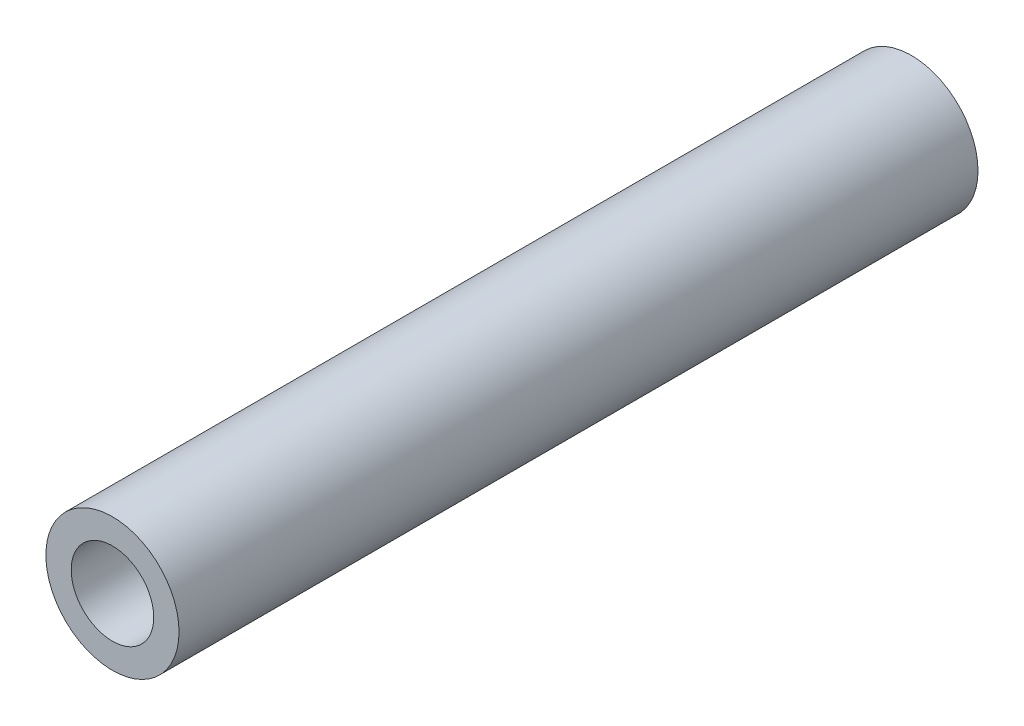
ISO-10303-21;
HEADER;
FILE_DESCRIPTION(('STEP AP214'),'2;1');
FILE_NAME('part.step','',(''),(''),'','','');
FILE_SCHEMA(('AUTOMOTIVE_DESIGN { 1 0 10303 214 1 1 1 1 }'));
ENDSEC;
DATA;
#1=APPLICATION_CONTEXT('core data for automotive mechanical design processes');
#2=APPLICATION_PROTOCOL_DEFINITION('international standard','automotive_design',2000,#1);
#3=PRODUCT_CONTEXT('',#1,'mechanical');
#4=PRODUCT('Part','Part','',(#3));
#5=PRODUCT_RELATED_PRODUCT_CATEGORY('part','',(#4));
#6=PRODUCT_DEFINITION_FORMATION('','',#4);
#7=PRODUCT_DEFINITION_CONTEXT('part definition',#1,'design');
#8=PRODUCT_DEFINITION('design','',#6,#7);
#9=PRODUCT_DEFINITION_SHAPE('','',#8);
#10=(LENGTH_UNIT() NAMED_UNIT(*) SI_UNIT(.MILLI.,.METRE.));
#11=(NAMED_UNIT(*) PLANE_ANGLE_UNIT() SI_UNIT($,.RADIAN.));
#12=(NAMED_UNIT(*) SI_UNIT($,.STERADIAN.) SOLID_ANGLE_UNIT());
#13=UNCERTAINTY_MEASURE_WITH_UNIT(LENGTH_MEASURE(1.E-05),#10,'distance_accuracy_value','');
#14=(GEOMETRIC_REPRESENTATION_CONTEXT(3) GLOBAL_UNCERTAINTY_ASSIGNED_CONTEXT((#13)) GLOBAL_UNIT_ASSIGNED_CONTEXT((#10,
#11,#12)) REPRESENTATION_CONTEXT('',''));
#15=CARTESIAN_POINT('',(0.,0.,0.));
#16=DIRECTION('',(0.,0.,1.));
#17=DIRECTION('',(1.,0.,0.));
#18=AXIS2_PLACEMENT_3D('',#15,#16,#17);
#19=CARTESIAN_POINT('',(0.,0.,30.));
#20=DIRECTION('',(0.,0.,1.));
#21=DIRECTION('',(1.,0.,0.));
#22=AXIS2_PLACEMENT_3D('',#19,#20,#21);
#23=PLANE('',#22);
#24=CARTESIAN_POINT('',(0.,0.,30.));
#25=DIRECTION('',(0.,0.,1.));
#26=DIRECTION('',(1.,0.,0.));
#27=AXIS2_PLACEMENT_3D('',#24,#25,#26);
#28=CIRCLE('',#27,2.5);
#29=CARTESIAN_POINT('',(2.5,0.,30.));
#30=VERTEX_POINT('',#29);
#31=EDGE_CURVE('E10',#30,#30,#28,.T.);
#32=ORIENTED_EDGE('',*,*,#31,.T.);
#33=EDGE_LOOP('',(#32));
#34=FACE_BOUND('',#33,.T.);
#35=CARTESIAN_POINT('',(0.,0.,30.));
#36=DIRECTION('',(0.,0.,1.));
#37=DIRECTION('',(1.,0.,0.));
#38=AXIS2_PLACEMENT_3D('',#35,#36,#37);
#39=CIRCLE('',#38,1.55);
#40=CARTESIAN_POINT('',(1.55,0.,30.));
#41=VERTEX_POINT('',#40);
#42=EDGE_CURVE('E44',#41,#41,#39,.T.);
#43=ORIENTED_EDGE('',*,*,#42,.F.);
#44=EDGE_LOOP('',(#43));
#45=FACE_BOUND('',#44,.T.);
#46=ADVANCED_FACE('F33',(#34,#45),#23,.T.);
#47=CARTESIAN_POINT('',(0.,0.,0.));
#48=DIRECTION('',(0.,0.,1.));
#49=DIRECTION('',(1.,0.,0.));
#50=AXIS2_PLACEMENT_3D('',#47,#48,#49);
#51=PLANE('',#50);
#52=CARTESIAN_POINT('',(0.,0.,0.));
#53=DIRECTION('',(0.,0.,1.));
#54=DIRECTION('',(1.,0.,0.));
#55=AXIS2_PLACEMENT_3D('',#52,#53,#54);
#56=CIRCLE('',#55,2.5);
#57=CARTESIAN_POINT('',(2.5,0.,0.));
#58=VERTEX_POINT('',#57);
#59=EDGE_CURVE('E37',#58,#58,#56,.T.);
#60=ORIENTED_EDGE('',*,*,#59,.F.);
#61=EDGE_LOOP('',(#60));
#62=FACE_BOUND('',#61,.T.);
#63=CARTESIAN_POINT('',(0.,0.,0.));
#64=DIRECTION('',(0.,0.,1.));
#65=DIRECTION('',(1.,0.,0.));
#66=AXIS2_PLACEMENT_3D('',#63,#64,#65);
#67=CIRCLE('',#66,1.55);
#68=CARTESIAN_POINT('',(1.55,0.,0.));
#69=VERTEX_POINT('',#68);
#70=EDGE_CURVE('E46',#69,#69,#67,.T.);
#71=ORIENTED_EDGE('',*,*,#70,.T.);
#72=EDGE_LOOP('',(#71));
#73=FACE_BOUND('',#72,.T.);
#74=ADVANCED_FACE('F56',(#62,#73),#51,.F.);
#75=CARTESIAN_POINT('',(0.,0.,30.));
#76=DIRECTION('',(0.,0.,-1.));
#77=DIRECTION('',(-1.,0.,0.));
#78=AXIS2_PLACEMENT_3D('',#75,#76,#77);
#79=CYLINDRICAL_SURFACE('',#78,2.5);
#80=ORIENTED_EDGE('',*,*,#31,.F.);
#81=EDGE_LOOP('',(#80));
#82=FACE_BOUND('',#81,.T.);
#83=ORIENTED_EDGE('',*,*,#59,.T.);
#84=EDGE_LOOP('',(#83));
#85=FACE_BOUND('',#84,.T.);
#86=ADVANCED_FACE('F35',(#82,#85),#79,.T.);
#87=CARTESIAN_POINT('',(0.,0.,30.));
#88=DIRECTION('',(0.,0.,-1.));
#89=DIRECTION('',(-1.,0.,0.));
#90=AXIS2_PLACEMENT_3D('',#87,#88,#89);
#91=CYLINDRICAL_SURFACE('',#90,1.55);
#92=ORIENTED_EDGE('',*,*,#42,.T.);
#93=EDGE_LOOP('',(#92));
#94=FACE_BOUND('',#93,.T.);
#95=ORIENTED_EDGE('',*,*,#70,.F.);
#96=EDGE_LOOP('',(#95));
#97=FACE_BOUND('',#96,.T.);
#98=ADVANCED_FACE('F52',(#94,#97),#91,.F.);
#99=CLOSED_SHELL('',(#46,#74,#86,#98));
#100=MANIFOLD_SOLID_BREP('B2',#99);
#101=ADVANCED_BREP_SHAPE_REPRESENTATION('',(#18,#100),#14);
#102=SHAPE_DEFINITION_REPRESENTATION(#9,#101);
ENDSEC;
END-ISO-10303-21;
